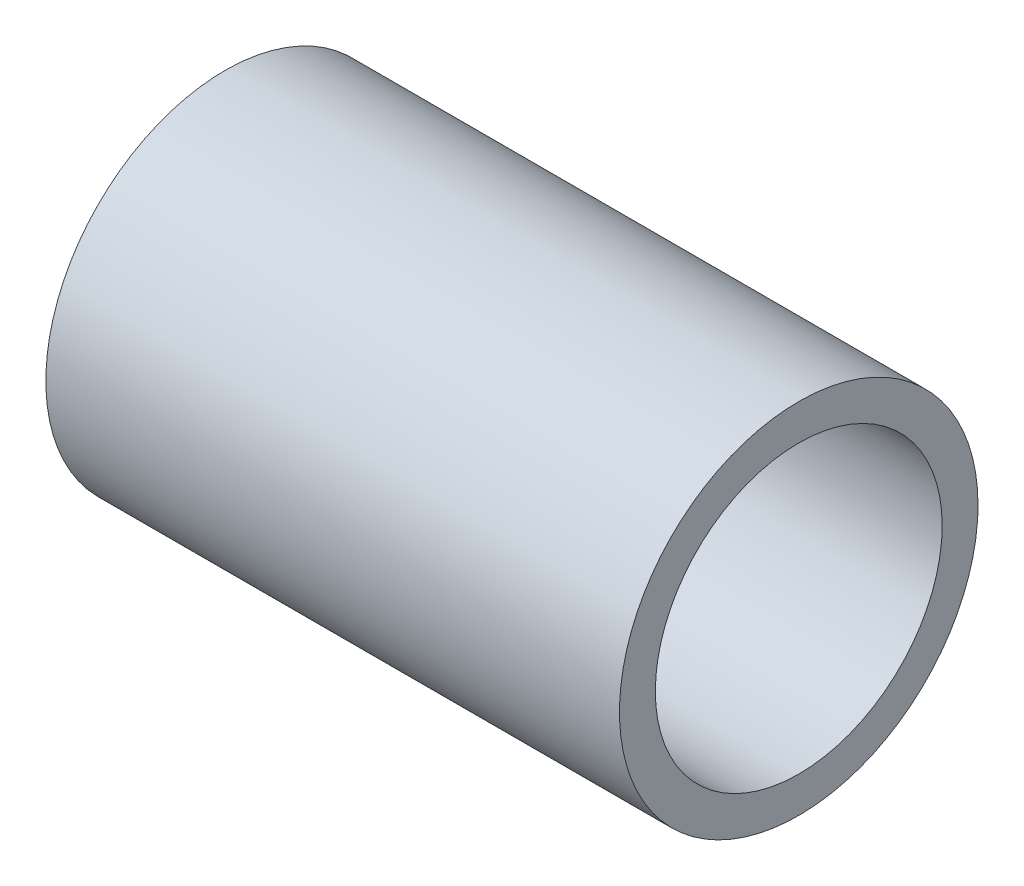
ISO-10303-21;
HEADER;
FILE_DESCRIPTION(('STEP AP214'),'2;1');
FILE_NAME('part.step','',(''),(''),'','','');
FILE_SCHEMA(('AUTOMOTIVE_DESIGN { 1 0 10303 214 1 1 1 1 }'));
ENDSEC;
DATA;
#1=APPLICATION_CONTEXT('core data for automotive mechanical design processes');
#2=APPLICATION_PROTOCOL_DEFINITION('international standard','automotive_design',2000,#1);
#3=PRODUCT_CONTEXT('',#1,'mechanical');
#4=PRODUCT('Part','Part','',(#3));
#5=PRODUCT_RELATED_PRODUCT_CATEGORY('part','',(#4));
#6=PRODUCT_DEFINITION_FORMATION('','',#4);
#7=PRODUCT_DEFINITION_CONTEXT('part definition',#1,'design');
#8=PRODUCT_DEFINITION('design','',#6,#7);
#9=PRODUCT_DEFINITION_SHAPE('','',#8);
#10=(LENGTH_UNIT() NAMED_UNIT(*) SI_UNIT(.MILLI.,.METRE.));
#11=(NAMED_UNIT(*) PLANE_ANGLE_UNIT() SI_UNIT($,.RADIAN.));
#12=(NAMED_UNIT(*) SI_UNIT($,.STERADIAN.) SOLID_ANGLE_UNIT());
#13=UNCERTAINTY_MEASURE_WITH_UNIT(LENGTH_MEASURE(1.E-05),#10,'distance_accuracy_value','');
#14=(GEOMETRIC_REPRESENTATION_CONTEXT(3) GLOBAL_UNCERTAINTY_ASSIGNED_CONTEXT((#13)) GLOBAL_UNIT_ASSIGNED_CONTEXT((#10,
#11,#12)) REPRESENTATION_CONTEXT('',''));
#15=CARTESIAN_POINT('',(0.,0.,0.));
#16=DIRECTION('',(0.,0.,1.));
#17=DIRECTION('',(1.,0.,0.));
#18=AXIS2_PLACEMENT_3D('',#15,#16,#17);
#19=CARTESIAN_POINT('',(80.,0.,0.));
#20=DIRECTION('',(1.,0.,0.));
#21=DIRECTION('',(0.,0.,-1.));
#22=AXIS2_PLACEMENT_3D('',#19,#20,#21);
#23=PLANE('',#22);
#24=CARTESIAN_POINT('',(80.,0.,0.));
#25=DIRECTION('',(1.,0.,0.));
#26=DIRECTION('',(0.,0.,-1.));
#27=AXIS2_PLACEMENT_3D('',#24,#25,#26);
#28=CIRCLE('',#27,25.);
#29=CARTESIAN_POINT('',(80.,0.,-25.));
#30=VERTEX_POINT('',#29);
#31=EDGE_CURVE('E93',#30,#30,#28,.T.);
#32=ORIENTED_EDGE('',*,*,#31,.T.);
#33=EDGE_LOOP('',(#32));
#34=FACE_BOUND('',#33,.T.);
#35=CARTESIAN_POINT('',(80.,0.,0.));
#36=DIRECTION('',(1.,0.,0.));
#37=DIRECTION('',(0.,0.,-1.));
#38=AXIS2_PLACEMENT_3D('',#35,#36,#37);
#39=CIRCLE('',#38,20.);
#40=CARTESIAN_POINT('',(80.,0.,-20.));
#41=VERTEX_POINT('',#40);
#42=EDGE_CURVE('E94',#41,#41,#39,.T.);
#43=ORIENTED_EDGE('',*,*,#42,.F.);
#44=EDGE_LOOP('',(#43));
#45=FACE_BOUND('',#44,.T.);
#46=ADVANCED_FACE('F34',(#34,#45),#23,.T.);
#47=CARTESIAN_POINT('',(0.,0.,0.));
#48=DIRECTION('',(1.,0.,0.));
#49=DIRECTION('',(0.,0.,-1.));
#50=AXIS2_PLACEMENT_3D('',#47,#48,#49);
#51=PLANE('',#50);
#52=CARTESIAN_POINT('',(0.,0.,0.));
#53=DIRECTION('',(1.,0.,0.));
#54=DIRECTION('',(0.,0.,-1.));
#55=AXIS2_PLACEMENT_3D('',#52,#53,#54);
#56=CIRCLE('',#55,25.);
#57=CARTESIAN_POINT('',(0.,2.,-24.9198715887542));
#58=VERTEX_POINT('',#57);
#59=CARTESIAN_POINT('',(0.,-2.,-24.9198715887542));
#60=VERTEX_POINT('',#59);
#61=EDGE_CURVE('E88',#58,#60,#56,.T.);
#62=ORIENTED_EDGE('',*,*,#61,.F.);
#63=DIRECTION('',(0.,0.,1.));
#64=VECTOR('',#63,1.);
#65=CARTESIAN_POINT('',(0.,2.,-80.));
#66=LINE('',#65,#64);
#67=CARTESIAN_POINT('',(0.,2.,-19.8997487421324));
#68=VERTEX_POINT('',#67);
#69=EDGE_CURVE('E74',#58,#68,#66,.T.);
#70=ORIENTED_EDGE('',*,*,#69,.T.);
#71=CARTESIAN_POINT('',(0.,0.,0.));
#72=DIRECTION('',(1.,0.,0.));
#73=DIRECTION('',(0.,0.,-1.));
#74=AXIS2_PLACEMENT_3D('',#71,#72,#73);
#75=CIRCLE('',#74,20.);
#76=CARTESIAN_POINT('',(0.,-2.,-19.8997487421324));
#77=VERTEX_POINT('',#76);
#78=EDGE_CURVE('E90',#68,#77,#75,.T.);
#79=ORIENTED_EDGE('',*,*,#78,.T.);
#80=DIRECTION('',(0.,0.,1.));
#81=VECTOR('',#80,1.);
#82=CARTESIAN_POINT('',(0.,-2.,-80.));
#83=LINE('',#82,#81);
#84=EDGE_CURVE('E49',#60,#77,#83,.T.);
#85=ORIENTED_EDGE('',*,*,#84,.F.);
#86=EDGE_LOOP('',(#62,#70,#79,#85));
#87=FACE_BOUND('',#86,.T.);
#88=ADVANCED_FACE('F92',(#87),#51,.F.);
#89=CARTESIAN_POINT('',(80.,0.,0.));
#90=DIRECTION('',(-1.,0.,0.));
#91=DIRECTION('',(0.,0.,1.));
#92=AXIS2_PLACEMENT_3D('',#89,#90,#91);
#93=CYLINDRICAL_SURFACE('',#92,25.);
#94=ORIENTED_EDGE('',*,*,#31,.F.);
#95=EDGE_LOOP('',(#94));
#96=FACE_BOUND('',#95,.T.);
#97=CARTESIAN_POINT('',(5.,0.,0.));
#98=DIRECTION('',(1.,0.,0.));
#99=DIRECTION('',(0.,0.,-1.));
#100=AXIS2_PLACEMENT_3D('',#97,#98,#99);
#101=CIRCLE('',#100,25.);
#102=CARTESIAN_POINT('',(5.,-2.,-24.9198715887542));
#103=VERTEX_POINT('',#102);
#104=CARTESIAN_POINT('',(5.,2.,-24.9198715887542));
#105=VERTEX_POINT('',#104);
#106=EDGE_CURVE('E89',#103,#105,#101,.T.);
#107=ORIENTED_EDGE('',*,*,#106,.T.);
#108=DIRECTION('',(-1.,0.,0.));
#109=VECTOR('',#108,1.);
#110=CARTESIAN_POINT('',(80.,1.99999999999999,-24.9198715887542));
#111=LINE('',#110,#109);
#112=EDGE_CURVE('E77',#105,#58,#111,.T.);
#113=ORIENTED_EDGE('',*,*,#112,.T.);
#114=ORIENTED_EDGE('',*,*,#61,.T.);
#115=DIRECTION('',(-1.,0.,0.));
#116=VECTOR('',#115,1.);
#117=CARTESIAN_POINT('',(80.,-2.,-24.9198715887542));
#118=LINE('',#117,#116);
#119=EDGE_CURVE('E114',#60,#103,#118,.F.);
#120=ORIENTED_EDGE('',*,*,#119,.T.);
#121=EDGE_LOOP('',(#107,#113,#114,#120));
#122=FACE_BOUND('',#121,.T.);
#123=ADVANCED_FACE('F36',(#96,#122),#93,.T.);
#124=CARTESIAN_POINT('',(80.,0.,0.));
#125=DIRECTION('',(-1.,0.,0.));
#126=DIRECTION('',(0.,0.,1.));
#127=AXIS2_PLACEMENT_3D('',#124,#125,#126);
#128=CYLINDRICAL_SURFACE('',#127,20.);
#129=DIRECTION('',(-1.,0.,0.));
#130=VECTOR('',#129,1.);
#131=CARTESIAN_POINT('',(80.,1.99999999999999,-19.8997487421324));
#132=LINE('',#131,#130);
#133=CARTESIAN_POINT('',(5.,2.,-19.8997487421324));
#134=VERTEX_POINT('',#133);
#135=EDGE_CURVE('E11',#134,#68,#132,.T.);
#136=ORIENTED_EDGE('',*,*,#135,.F.);
#137=CARTESIAN_POINT('',(5.,0.,0.));
#138=DIRECTION('',(1.,0.,0.));
#139=DIRECTION('',(0.,0.,-1.));
#140=AXIS2_PLACEMENT_3D('',#137,#138,#139);
#141=CIRCLE('',#140,20.);
#142=CARTESIAN_POINT('',(5.,-2.,-19.8997487421324));
#143=VERTEX_POINT('',#142);
#144=EDGE_CURVE('E42',#143,#134,#141,.T.);
#145=ORIENTED_EDGE('',*,*,#144,.F.);
#146=DIRECTION('',(-1.,0.,0.));
#147=VECTOR('',#146,1.);
#148=CARTESIAN_POINT('',(80.,-2.,-19.8997487421324));
#149=LINE('',#148,#147);
#150=EDGE_CURVE('E97',#77,#143,#149,.F.);
#151=ORIENTED_EDGE('',*,*,#150,.F.);
#152=ORIENTED_EDGE('',*,*,#78,.F.);
#153=EDGE_LOOP('',(#136,#145,#151,#152));
#154=FACE_BOUND('',#153,.T.);
#155=ORIENTED_EDGE('',*,*,#42,.T.);
#156=EDGE_LOOP('',(#155));
#157=FACE_BOUND('',#156,.T.);
#158=ADVANCED_FACE('F110',(#154,#157),#128,.F.);
#159=CARTESIAN_POINT('',(5.,2.,-80.));
#160=DIRECTION('',(0.,1.,0.));
#161=DIRECTION('',(-1.,0.,0.));
#162=AXIS2_PLACEMENT_3D('',#159,#160,#161);
#163=PLANE('',#162);
#164=DIRECTION('',(0.,0.,1.));
#165=VECTOR('',#164,1.);
#166=CARTESIAN_POINT('',(5.,2.,-80.));
#167=LINE('',#166,#165);
#168=EDGE_CURVE('E108',#105,#134,#167,.T.);
#169=ORIENTED_EDGE('',*,*,#168,.T.);
#170=ORIENTED_EDGE('',*,*,#135,.T.);
#171=ORIENTED_EDGE('',*,*,#69,.F.);
#172=ORIENTED_EDGE('',*,*,#112,.F.);
#173=EDGE_LOOP('',(#169,#170,#171,#172));
#174=FACE_BOUND('',#173,.T.);
#175=ADVANCED_FACE('F76',(#174),#163,.F.);
#176=CARTESIAN_POINT('',(5.,-2.,-80.));
#177=DIRECTION('',(1.,0.,0.));
#178=DIRECTION('',(0.,0.,-1.));
#179=AXIS2_PLACEMENT_3D('',#176,#177,#178);
#180=PLANE('',#179);
#181=DIRECTION('',(0.,0.,1.));
#182=VECTOR('',#181,1.);
#183=CARTESIAN_POINT('',(5.,-2.,-80.));
#184=LINE('',#183,#182);
#185=EDGE_CURVE('E105',#103,#143,#184,.T.);
#186=ORIENTED_EDGE('',*,*,#185,.T.);
#187=ORIENTED_EDGE('',*,*,#144,.T.);
#188=ORIENTED_EDGE('',*,*,#168,.F.);
#189=ORIENTED_EDGE('',*,*,#106,.F.);
#190=EDGE_LOOP('',(#186,#187,#188,#189));
#191=FACE_BOUND('',#190,.T.);
#192=ADVANCED_FACE('F107',(#191),#180,.F.);
#193=CARTESIAN_POINT('',(0.,-2.,-80.));
#194=DIRECTION('',(0.,-1.,0.));
#195=DIRECTION('',(0.,0.,-1.));
#196=AXIS2_PLACEMENT_3D('',#193,#194,#195);
#197=PLANE('',#196);
#198=ORIENTED_EDGE('',*,*,#84,.T.);
#199=ORIENTED_EDGE('',*,*,#150,.T.);
#200=ORIENTED_EDGE('',*,*,#185,.F.);
#201=ORIENTED_EDGE('',*,*,#119,.F.);
#202=EDGE_LOOP('',(#198,#199,#200,#201));
#203=FACE_BOUND('',#202,.T.);
#204=ADVANCED_FACE('F104',(#203),#197,.F.);
#205=CLOSED_SHELL('',(#46,#88,#123,#158,#175,#192,#204));
#206=MANIFOLD_SOLID_BREP('B2',#205);
#207=ADVANCED_BREP_SHAPE_REPRESENTATION('',(#18,#206),#14);
#208=SHAPE_DEFINITION_REPRESENTATION(#9,#207);
ENDSEC;
END-ISO-10303-21;
